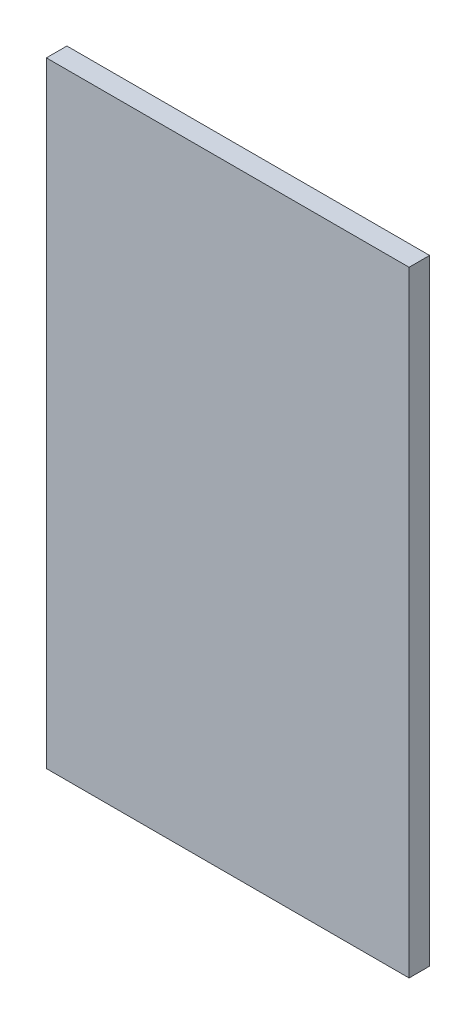
ISO-10303-21;
HEADER;
FILE_DESCRIPTION(('STEP AP214'),'2;1');
FILE_NAME('part.step','',(''),(''),'','','');
FILE_SCHEMA(('AUTOMOTIVE_DESIGN { 1 0 10303 214 1 1 1 1 }'));
ENDSEC;
DATA;
#1=APPLICATION_CONTEXT('core data for automotive mechanical design processes');
#2=APPLICATION_PROTOCOL_DEFINITION('international standard','automotive_design',2000,#1);
#3=PRODUCT_CONTEXT('',#1,'mechanical');
#4=PRODUCT('Part','Part','',(#3));
#5=PRODUCT_RELATED_PRODUCT_CATEGORY('part','',(#4));
#6=PRODUCT_DEFINITION_FORMATION('','',#4);
#7=PRODUCT_DEFINITION_CONTEXT('part definition',#1,'design');
#8=PRODUCT_DEFINITION('design','',#6,#7);
#9=PRODUCT_DEFINITION_SHAPE('','',#8);
#10=(LENGTH_UNIT() NAMED_UNIT(*) SI_UNIT(.MILLI.,.METRE.));
#11=(NAMED_UNIT(*) PLANE_ANGLE_UNIT() SI_UNIT($,.RADIAN.));
#12=(NAMED_UNIT(*) SI_UNIT($,.STERADIAN.) SOLID_ANGLE_UNIT());
#13=UNCERTAINTY_MEASURE_WITH_UNIT(LENGTH_MEASURE(1.E-05),#10,'distance_accuracy_value','');
#14=(GEOMETRIC_REPRESENTATION_CONTEXT(3) GLOBAL_UNCERTAINTY_ASSIGNED_CONTEXT((#13)) GLOBAL_UNIT_ASSIGNED_CONTEXT((#10,
#11,#12)) REPRESENTATION_CONTEXT('',''));
#15=CARTESIAN_POINT('',(0.,0.,0.));
#16=DIRECTION('',(0.,0.,1.));
#17=DIRECTION('',(1.,0.,0.));
#18=AXIS2_PLACEMENT_3D('',#15,#16,#17);
#19=CARTESIAN_POINT('',(44.195,-75.,5.));
#20=DIRECTION('',(-1.,0.,0.));
#21=DIRECTION('',(0.,0.,1.));
#22=AXIS2_PLACEMENT_3D('',#19,#20,#21);
#23=PLANE('',#22);
#24=DIRECTION('',(0.,1.,0.));
#25=VECTOR('',#24,1.);
#26=CARTESIAN_POINT('',(44.195,-75.,0.));
#27=LINE('',#26,#25);
#28=CARTESIAN_POINT('',(44.195,-75.,0.));
#29=VERTEX_POINT('',#28);
#30=CARTESIAN_POINT('',(44.195,75.,0.));
#31=VERTEX_POINT('',#30);
#32=EDGE_CURVE('E102',#29,#31,#27,.T.);
#33=ORIENTED_EDGE('',*,*,#32,.T.);
#34=DIRECTION('',(0.,0.,-1.));
#35=VECTOR('',#34,1.);
#36=CARTESIAN_POINT('',(44.195,75.,5.));
#37=LINE('',#36,#35);
#38=CARTESIAN_POINT('',(44.195,75.,5.));
#39=VERTEX_POINT('',#38);
#40=EDGE_CURVE('E11',#39,#31,#37,.T.);
#41=ORIENTED_EDGE('',*,*,#40,.F.);
#42=DIRECTION('',(0.,1.,0.));
#43=VECTOR('',#42,1.);
#44=CARTESIAN_POINT('',(44.195,-75.,5.));
#45=LINE('',#44,#43);
#46=CARTESIAN_POINT('',(44.195,-75.,5.));
#47=VERTEX_POINT('',#46);
#48=EDGE_CURVE('E90',#47,#39,#45,.T.);
#49=ORIENTED_EDGE('',*,*,#48,.F.);
#50=DIRECTION('',(0.,0.,-1.));
#51=VECTOR('',#50,1.);
#52=CARTESIAN_POINT('',(44.195,-75.,5.));
#53=LINE('',#52,#51);
#54=EDGE_CURVE('E98',#47,#29,#53,.T.);
#55=ORIENTED_EDGE('',*,*,#54,.T.);
#56=EDGE_LOOP('',(#33,#41,#49,#55));
#57=FACE_BOUND('',#56,.T.);
#58=ADVANCED_FACE('F39',(#57),#23,.F.);
#59=CARTESIAN_POINT('',(-44.195,75.,5.));
#60=DIRECTION('',(0.,-1.,0.));
#61=DIRECTION('',(0.,0.,-1.));
#62=AXIS2_PLACEMENT_3D('',#59,#60,#61);
#63=PLANE('',#62);
#64=DIRECTION('',(-1.,0.,0.));
#65=VECTOR('',#64,1.);
#66=CARTESIAN_POINT('',(-44.195,75.,0.));
#67=LINE('',#66,#65);
#68=CARTESIAN_POINT('',(-44.195,75.,0.));
#69=VERTEX_POINT('',#68);
#70=EDGE_CURVE('E94',#31,#69,#67,.T.);
#71=ORIENTED_EDGE('',*,*,#70,.T.);
#72=DIRECTION('',(0.,0.,-1.));
#73=VECTOR('',#72,1.);
#74=CARTESIAN_POINT('',(-44.195,75.,5.));
#75=LINE('',#74,#73);
#76=CARTESIAN_POINT('',(-44.195,75.,5.));
#77=VERTEX_POINT('',#76);
#78=EDGE_CURVE('E47',#77,#69,#75,.T.);
#79=ORIENTED_EDGE('',*,*,#78,.F.);
#80=DIRECTION('',(-1.,0.,0.));
#81=VECTOR('',#80,1.);
#82=CARTESIAN_POINT('',(-44.195,75.,5.));
#83=LINE('',#82,#81);
#84=EDGE_CURVE('E85',#39,#77,#83,.T.);
#85=ORIENTED_EDGE('',*,*,#84,.F.);
#86=ORIENTED_EDGE('',*,*,#40,.T.);
#87=EDGE_LOOP('',(#71,#79,#85,#86));
#88=FACE_BOUND('',#87,.T.);
#89=ADVANCED_FACE('F93',(#88),#63,.F.);
#90=CARTESIAN_POINT('',(-44.195,-75.,5.));
#91=DIRECTION('',(1.,0.,0.));
#92=DIRECTION('',(0.,0.,-1.));
#93=AXIS2_PLACEMENT_3D('',#90,#91,#92);
#94=PLANE('',#93);
#95=DIRECTION('',(0.,-1.,0.));
#96=VECTOR('',#95,1.);
#97=CARTESIAN_POINT('',(-44.195,-75.,0.));
#98=LINE('',#97,#96);
#99=CARTESIAN_POINT('',(-44.195,-75.,0.));
#100=VERTEX_POINT('',#99);
#101=EDGE_CURVE('E72',#69,#100,#98,.T.);
#102=ORIENTED_EDGE('',*,*,#101,.T.);
#103=DIRECTION('',(0.,0.,-1.));
#104=VECTOR('',#103,1.);
#105=CARTESIAN_POINT('',(-44.195,-75.,5.));
#106=LINE('',#105,#104);
#107=CARTESIAN_POINT('',(-44.195,-75.,5.));
#108=VERTEX_POINT('',#107);
#109=EDGE_CURVE('E95',#108,#100,#106,.T.);
#110=ORIENTED_EDGE('',*,*,#109,.F.);
#111=DIRECTION('',(0.,-1.,0.));
#112=VECTOR('',#111,1.);
#113=CARTESIAN_POINT('',(-44.195,-75.,5.));
#114=LINE('',#113,#112);
#115=EDGE_CURVE('E88',#77,#108,#114,.T.);
#116=ORIENTED_EDGE('',*,*,#115,.F.);
#117=ORIENTED_EDGE('',*,*,#78,.T.);
#118=EDGE_LOOP('',(#102,#110,#116,#117));
#119=FACE_BOUND('',#118,.T.);
#120=ADVANCED_FACE('F96',(#119),#94,.F.);
#121=CARTESIAN_POINT('',(-44.195,-75.,5.));
#122=DIRECTION('',(0.,1.,0.));
#123=DIRECTION('',(0.,0.,1.));
#124=AXIS2_PLACEMENT_3D('',#121,#122,#123);
#125=PLANE('',#124);
#126=DIRECTION('',(1.,0.,0.));
#127=VECTOR('',#126,1.);
#128=CARTESIAN_POINT('',(-44.195,-75.,0.));
#129=LINE('',#128,#127);
#130=EDGE_CURVE('E78',#100,#29,#129,.T.);
#131=ORIENTED_EDGE('',*,*,#130,.T.);
#132=ORIENTED_EDGE('',*,*,#54,.F.);
#133=DIRECTION('',(1.,0.,0.));
#134=VECTOR('',#133,1.);
#135=CARTESIAN_POINT('',(-44.195,-75.,5.));
#136=LINE('',#135,#134);
#137=EDGE_CURVE('E55',#108,#47,#136,.T.);
#138=ORIENTED_EDGE('',*,*,#137,.F.);
#139=ORIENTED_EDGE('',*,*,#109,.T.);
#140=EDGE_LOOP('',(#131,#132,#138,#139));
#141=FACE_BOUND('',#140,.T.);
#142=ADVANCED_FACE('F109',(#141),#125,.F.);
#143=CARTESIAN_POINT('',(0.,0.,5.));
#144=DIRECTION('',(0.,0.,-1.));
#145=DIRECTION('',(-1.,0.,0.));
#146=AXIS2_PLACEMENT_3D('',#143,#144,#145);
#147=PLANE('',#146);
#148=ORIENTED_EDGE('',*,*,#48,.T.);
#149=ORIENTED_EDGE('',*,*,#84,.T.);
#150=ORIENTED_EDGE('',*,*,#115,.T.);
#151=ORIENTED_EDGE('',*,*,#137,.T.);
#152=EDGE_LOOP('',(#148,#149,#150,#151));
#153=FACE_BOUND('',#152,.T.);
#154=ADVANCED_FACE('F86',(#153),#147,.F.);
#155=CARTESIAN_POINT('',(0.,0.,0.));
#156=DIRECTION('',(0.,0.,-1.));
#157=DIRECTION('',(-1.,0.,0.));
#158=AXIS2_PLACEMENT_3D('',#155,#156,#157);
#159=PLANE('',#158);
#160=ORIENTED_EDGE('',*,*,#32,.F.);
#161=ORIENTED_EDGE('',*,*,#130,.F.);
#162=ORIENTED_EDGE('',*,*,#101,.F.);
#163=ORIENTED_EDGE('',*,*,#70,.F.);
#164=EDGE_LOOP('',(#160,#161,#162,#163));
#165=FACE_BOUND('',#164,.T.);
#166=ADVANCED_FACE('F112',(#165),#159,.T.);
#167=CLOSED_SHELL('',(#58,#89,#120,#142,#154,#166));
#168=MANIFOLD_SOLID_BREP('B2',#167);
#169=ADVANCED_BREP_SHAPE_REPRESENTATION('',(#18,#168),#14);
#170=SHAPE_DEFINITION_REPRESENTATION(#9,#169);
ENDSEC;
END-ISO-10303-21;
